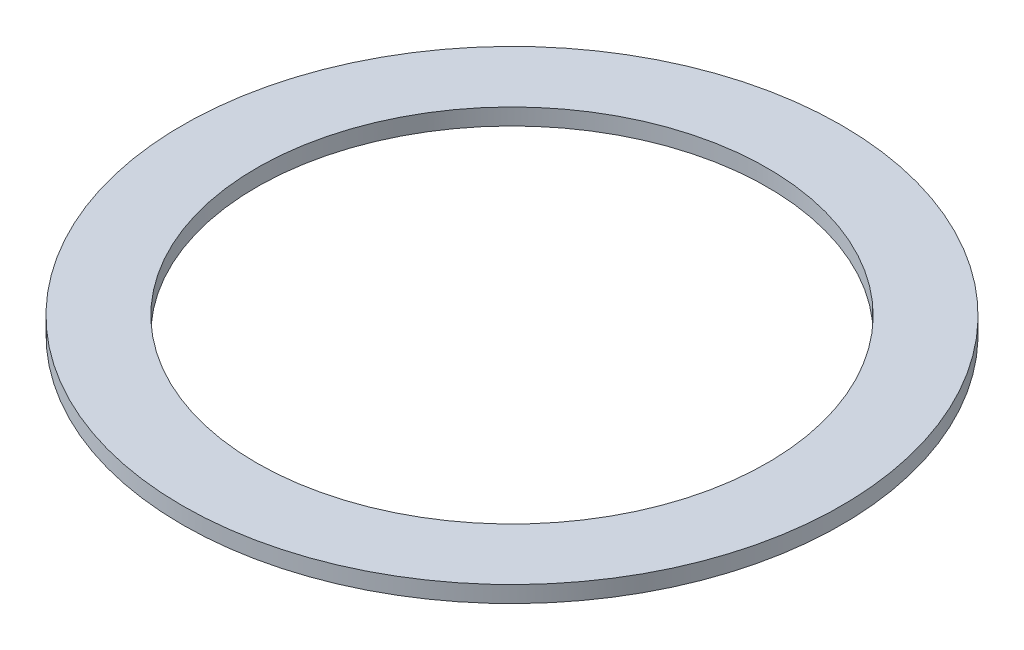
ISO-10303-21;
HEADER;
FILE_DESCRIPTION(('STEP AP214'),'2;1');
FILE_NAME('part.step','',(''),(''),'','','');
FILE_SCHEMA(('AUTOMOTIVE_DESIGN { 1 0 10303 214 1 1 1 1 }'));
ENDSEC;
DATA;
#1=APPLICATION_CONTEXT('core data for automotive mechanical design processes');
#2=APPLICATION_PROTOCOL_DEFINITION('international standard','automotive_design',2000,#1);
#3=PRODUCT_CONTEXT('',#1,'mechanical');
#4=PRODUCT('Part','Part','',(#3));
#5=PRODUCT_RELATED_PRODUCT_CATEGORY('part','',(#4));
#6=PRODUCT_DEFINITION_FORMATION('','',#4);
#7=PRODUCT_DEFINITION_CONTEXT('part definition',#1,'design');
#8=PRODUCT_DEFINITION('design','',#6,#7);
#9=PRODUCT_DEFINITION_SHAPE('','',#8);
#10=(LENGTH_UNIT() NAMED_UNIT(*) SI_UNIT(.MILLI.,.METRE.));
#11=(NAMED_UNIT(*) PLANE_ANGLE_UNIT() SI_UNIT($,.RADIAN.));
#12=(NAMED_UNIT(*) SI_UNIT($,.STERADIAN.) SOLID_ANGLE_UNIT());
#13=UNCERTAINTY_MEASURE_WITH_UNIT(LENGTH_MEASURE(1.E-05),#10,'distance_accuracy_value','');
#14=(GEOMETRIC_REPRESENTATION_CONTEXT(3) GLOBAL_UNCERTAINTY_ASSIGNED_CONTEXT((#13)) GLOBAL_UNIT_ASSIGNED_CONTEXT((#10,
#11,#12)) REPRESENTATION_CONTEXT('',''));
#15=CARTESIAN_POINT('',(0.,0.,0.));
#16=DIRECTION('',(0.,0.,1.));
#17=DIRECTION('',(1.,0.,0.));
#18=AXIS2_PLACEMENT_3D('',#15,#16,#17);
#19=CARTESIAN_POINT('',(0.,2.,0.));
#20=DIRECTION('',(0.,1.,0.));
#21=DIRECTION('',(0.,0.,1.));
#22=AXIS2_PLACEMENT_3D('',#19,#20,#21);
#23=PLANE('',#22);
#24=CARTESIAN_POINT('',(0.,2.,0.));
#25=DIRECTION('',(0.,1.,0.));
#26=DIRECTION('',(0.,0.,1.));
#27=AXIS2_PLACEMENT_3D('',#24,#25,#26);
#28=CIRCLE('',#27,40.);
#29=CARTESIAN_POINT('',(0.,2.,40.));
#30=VERTEX_POINT('',#29);
#31=EDGE_CURVE('E10',#30,#30,#28,.T.);
#32=ORIENTED_EDGE('',*,*,#31,.T.);
#33=EDGE_LOOP('',(#32));
#34=FACE_BOUND('',#33,.T.);
#35=CARTESIAN_POINT('',(0.,2.,0.));
#36=DIRECTION('',(0.,1.,0.));
#37=DIRECTION('',(0.,0.,1.));
#38=AXIS2_PLACEMENT_3D('',#35,#36,#37);
#39=CIRCLE('',#38,31.);
#40=CARTESIAN_POINT('',(0.,2.,31.));
#41=VERTEX_POINT('',#40);
#42=EDGE_CURVE('E55',#41,#41,#39,.T.);
#43=ORIENTED_EDGE('',*,*,#42,.F.);
#44=EDGE_LOOP('',(#43));
#45=FACE_BOUND('',#44,.T.);
#46=ADVANCED_FACE('F41',(#34,#45),#23,.T.);
#47=CARTESIAN_POINT('',(0.,0.,0.));
#48=DIRECTION('',(0.,1.,0.));
#49=DIRECTION('',(0.,0.,1.));
#50=AXIS2_PLACEMENT_3D('',#47,#48,#49);
#51=PLANE('',#50);
#52=CARTESIAN_POINT('',(0.,0.,0.));
#53=DIRECTION('',(0.,1.,0.));
#54=DIRECTION('',(0.,0.,1.));
#55=AXIS2_PLACEMENT_3D('',#52,#53,#54);
#56=CIRCLE('',#55,40.);
#57=CARTESIAN_POINT('',(0.,0.,40.));
#58=VERTEX_POINT('',#57);
#59=EDGE_CURVE('E45',#58,#58,#56,.T.);
#60=ORIENTED_EDGE('',*,*,#59,.F.);
#61=EDGE_LOOP('',(#60));
#62=FACE_BOUND('',#61,.T.);
#63=CARTESIAN_POINT('',(0.,0.,0.));
#64=DIRECTION('',(0.,1.,0.));
#65=DIRECTION('',(0.,0.,1.));
#66=AXIS2_PLACEMENT_3D('',#63,#64,#65);
#67=CIRCLE('',#66,31.);
#68=CARTESIAN_POINT('',(0.,0.,31.));
#69=VERTEX_POINT('',#68);
#70=EDGE_CURVE('E57',#69,#69,#67,.T.);
#71=ORIENTED_EDGE('',*,*,#70,.T.);
#72=EDGE_LOOP('',(#71));
#73=FACE_BOUND('',#72,.T.);
#74=ADVANCED_FACE('F70',(#62,#73),#51,.F.);
#75=CARTESIAN_POINT('',(0.,2.,0.));
#76=DIRECTION('',(0.,-1.,0.));
#77=DIRECTION('',(0.,0.,-1.));
#78=AXIS2_PLACEMENT_3D('',#75,#76,#77);
#79=CYLINDRICAL_SURFACE('',#78,40.);
#80=ORIENTED_EDGE('',*,*,#31,.F.);
#81=EDGE_LOOP('',(#80));
#82=FACE_BOUND('',#81,.T.);
#83=ORIENTED_EDGE('',*,*,#59,.T.);
#84=EDGE_LOOP('',(#83));
#85=FACE_BOUND('',#84,.T.);
#86=ADVANCED_FACE('F43',(#82,#85),#79,.T.);
#87=CARTESIAN_POINT('',(0.,2.,0.));
#88=DIRECTION('',(0.,-1.,0.));
#89=DIRECTION('',(0.,0.,-1.));
#90=AXIS2_PLACEMENT_3D('',#87,#88,#89);
#91=CYLINDRICAL_SURFACE('',#90,31.);
#92=ORIENTED_EDGE('',*,*,#42,.T.);
#93=EDGE_LOOP('',(#92));
#94=FACE_BOUND('',#93,.T.);
#95=ORIENTED_EDGE('',*,*,#70,.F.);
#96=EDGE_LOOP('',(#95));
#97=FACE_BOUND('',#96,.T.);
#98=ADVANCED_FACE('F66',(#94,#97),#91,.F.);
#99=CLOSED_SHELL('',(#46,#74,#86,#98));
#100=MANIFOLD_SOLID_BREP('B2',#99);
#101=ADVANCED_BREP_SHAPE_REPRESENTATION('',(#18,#100),#14);
#102=SHAPE_DEFINITION_REPRESENTATION(#9,#101);
ENDSEC;
END-ISO-10303-21;
